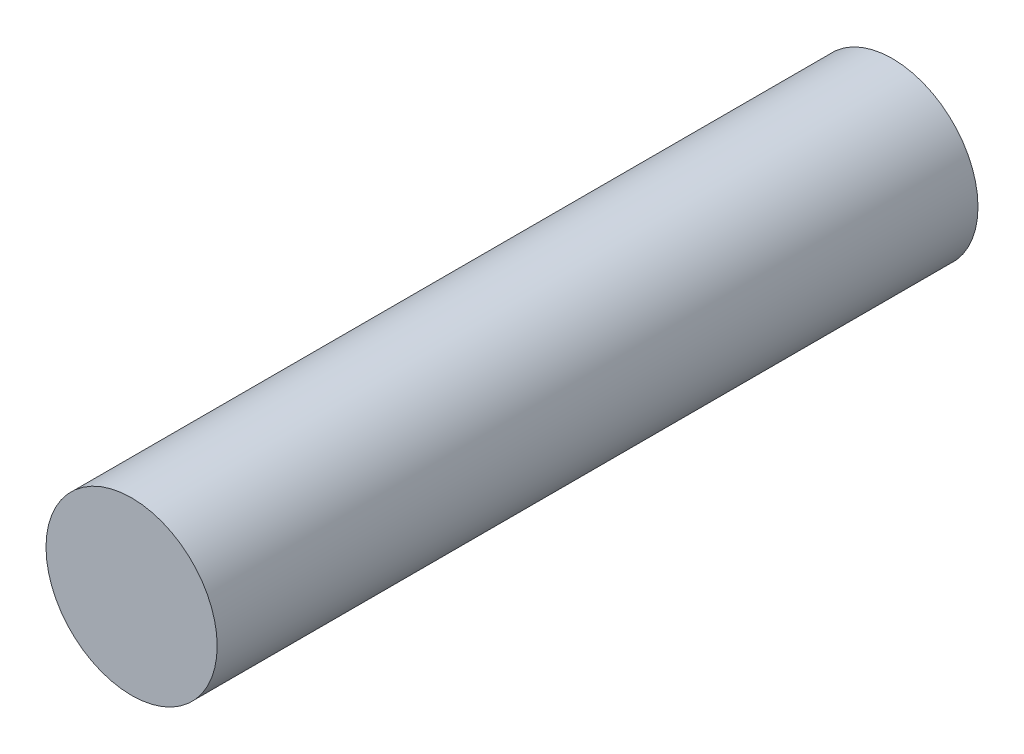
ISO-10303-21;
HEADER;
FILE_DESCRIPTION(('STEP AP214'),'2;1');
FILE_NAME('part.step','',(''),(''),'','','');
FILE_SCHEMA(('AUTOMOTIVE_DESIGN { 1 0 10303 214 1 1 1 1 }'));
ENDSEC;
DATA;
#1=APPLICATION_CONTEXT('core data for automotive mechanical design processes');
#2=APPLICATION_PROTOCOL_DEFINITION('international standard','automotive_design',2000,#1);
#3=PRODUCT_CONTEXT('',#1,'mechanical');
#4=PRODUCT('Part','Part','',(#3));
#5=PRODUCT_RELATED_PRODUCT_CATEGORY('part','',(#4));
#6=PRODUCT_DEFINITION_FORMATION('','',#4);
#7=PRODUCT_DEFINITION_CONTEXT('part definition',#1,'design');
#8=PRODUCT_DEFINITION('design','',#6,#7);
#9=PRODUCT_DEFINITION_SHAPE('','',#8);
#10=(LENGTH_UNIT() NAMED_UNIT(*) SI_UNIT(.MILLI.,.METRE.));
#11=(NAMED_UNIT(*) PLANE_ANGLE_UNIT() SI_UNIT($,.RADIAN.));
#12=(NAMED_UNIT(*) SI_UNIT($,.STERADIAN.) SOLID_ANGLE_UNIT());
#13=UNCERTAINTY_MEASURE_WITH_UNIT(LENGTH_MEASURE(1.E-05),#10,'distance_accuracy_value','');
#14=(GEOMETRIC_REPRESENTATION_CONTEXT(3) GLOBAL_UNCERTAINTY_ASSIGNED_CONTEXT((#13)) GLOBAL_UNIT_ASSIGNED_CONTEXT((#10,
#11,#12)) REPRESENTATION_CONTEXT('',''));
#15=CARTESIAN_POINT('',(0.,0.,0.));
#16=DIRECTION('',(0.,0.,1.));
#17=DIRECTION('',(1.,0.,0.));
#18=AXIS2_PLACEMENT_3D('',#15,#16,#17);
#19=CARTESIAN_POINT('',(0.,0.,40.));
#20=DIRECTION('',(0.,0.,-1.));
#21=DIRECTION('',(-1.,0.,0.));
#22=AXIS2_PLACEMENT_3D('',#19,#20,#21);
#23=CYLINDRICAL_SURFACE('',#22,4.5);
#24=CARTESIAN_POINT('',(0.,0.,40.));
#25=DIRECTION('',(0.,0.,1.));
#26=DIRECTION('',(1.,0.,0.));
#27=AXIS2_PLACEMENT_3D('',#24,#25,#26);
#28=CIRCLE('',#27,4.5);
#29=CARTESIAN_POINT('',(4.5,0.,40.));
#30=VERTEX_POINT('',#29);
#31=EDGE_CURVE('E10',#30,#30,#28,.T.);
#32=ORIENTED_EDGE('',*,*,#31,.F.);
#33=EDGE_LOOP('',(#32));
#34=FACE_BOUND('',#33,.T.);
#35=CARTESIAN_POINT('',(0.,0.,0.));
#36=DIRECTION('',(0.,0.,1.));
#37=DIRECTION('',(1.,0.,0.));
#38=AXIS2_PLACEMENT_3D('',#35,#36,#37);
#39=CIRCLE('',#38,4.5);
#40=CARTESIAN_POINT('',(4.5,0.,0.));
#41=VERTEX_POINT('',#40);
#42=EDGE_CURVE('E40',#41,#41,#39,.T.);
#43=ORIENTED_EDGE('',*,*,#42,.T.);
#44=EDGE_LOOP('',(#43));
#45=FACE_BOUND('',#44,.T.);
#46=ADVANCED_FACE('F37',(#34,#45),#23,.T.);
#47=CARTESIAN_POINT('',(0.,0.,40.));
#48=DIRECTION('',(0.,0.,1.));
#49=DIRECTION('',(1.,0.,0.));
#50=AXIS2_PLACEMENT_3D('',#47,#48,#49);
#51=PLANE('',#50);
#52=ORIENTED_EDGE('',*,*,#31,.T.);
#53=EDGE_LOOP('',(#52));
#54=FACE_BOUND('',#53,.T.);
#55=ADVANCED_FACE('F54',(#54),#51,.T.);
#56=CARTESIAN_POINT('',(0.,0.,0.));
#57=DIRECTION('',(0.,0.,1.));
#58=DIRECTION('',(1.,0.,0.));
#59=AXIS2_PLACEMENT_3D('',#56,#57,#58);
#60=PLANE('',#59);
#61=ORIENTED_EDGE('',*,*,#42,.F.);
#62=EDGE_LOOP('',(#61));
#63=FACE_BOUND('',#62,.T.);
#64=ADVANCED_FACE('F52',(#63),#60,.F.);
#65=CLOSED_SHELL('',(#46,#55,#64));
#66=MANIFOLD_SOLID_BREP('B2',#65);
#67=ADVANCED_BREP_SHAPE_REPRESENTATION('',(#18,#66),#14);
#68=SHAPE_DEFINITION_REPRESENTATION(#9,#67);
ENDSEC;
END-ISO-10303-21;
